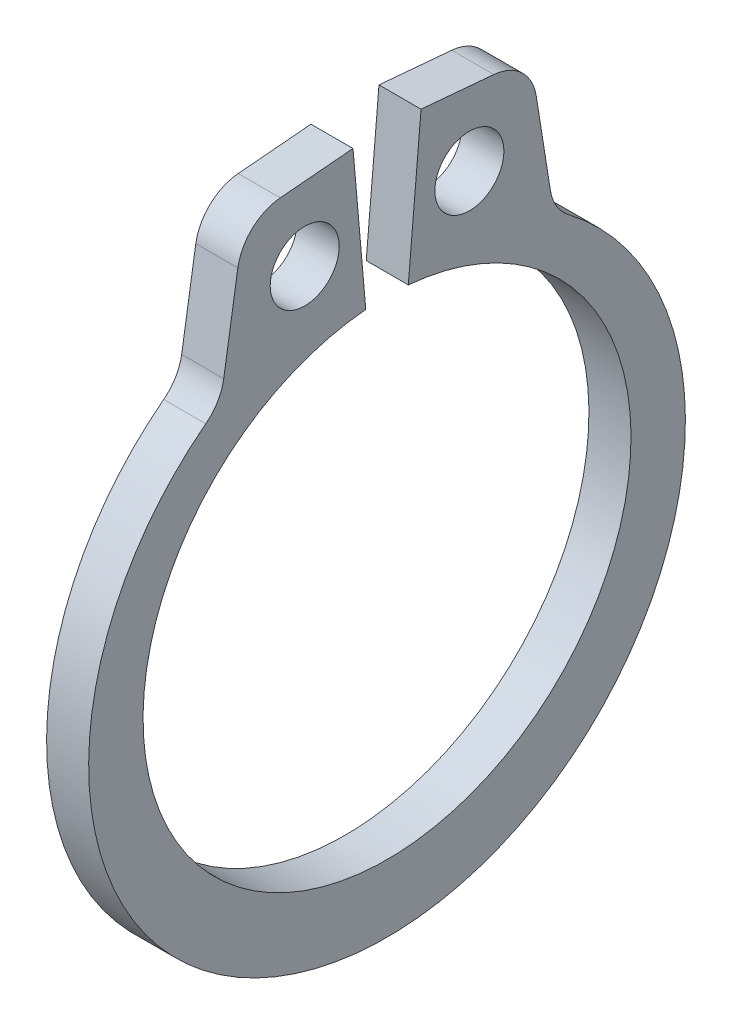
ISO-10303-21;
HEADER;
FILE_DESCRIPTION(('STEP AP214'),'2;1');
FILE_NAME('part.step','',(''),(''),'','','');
FILE_SCHEMA(('AUTOMOTIVE_DESIGN { 1 0 10303 214 1 1 1 1 }'));
ENDSEC;
DATA;
#1=APPLICATION_CONTEXT('core data for automotive mechanical design processes');
#2=APPLICATION_PROTOCOL_DEFINITION('international standard','automotive_design',2000,#1);
#3=PRODUCT_CONTEXT('',#1,'mechanical');
#4=PRODUCT('Part','Part','',(#3));
#5=PRODUCT_RELATED_PRODUCT_CATEGORY('part','',(#4));
#6=PRODUCT_DEFINITION_FORMATION('','',#4);
#7=PRODUCT_DEFINITION_CONTEXT('part definition',#1,'design');
#8=PRODUCT_DEFINITION('design','',#6,#7);
#9=PRODUCT_DEFINITION_SHAPE('','',#8);
#10=(LENGTH_UNIT() NAMED_UNIT(*) SI_UNIT(.MILLI.,.METRE.));
#11=(NAMED_UNIT(*) PLANE_ANGLE_UNIT() SI_UNIT($,.RADIAN.));
#12=(NAMED_UNIT(*) SI_UNIT($,.STERADIAN.) SOLID_ANGLE_UNIT());
#13=UNCERTAINTY_MEASURE_WITH_UNIT(LENGTH_MEASURE(1.E-05),#10,'distance_accuracy_value','');
#14=(GEOMETRIC_REPRESENTATION_CONTEXT(3) GLOBAL_UNCERTAINTY_ASSIGNED_CONTEXT((#13)) GLOBAL_UNIT_ASSIGNED_CONTEXT((#10,
#11,#12)) REPRESENTATION_CONTEXT('',''));
#15=CARTESIAN_POINT('',(0.,0.,0.));
#16=DIRECTION('',(0.,0.,1.));
#17=DIRECTION('',(1.,0.,0.));
#18=AXIS2_PLACEMENT_3D('',#15,#16,#17);
#19=CARTESIAN_POINT('',(0.3175,0.,0.));
#20=DIRECTION('',(1.,0.,0.));
#21=DIRECTION('',(0.,0.,-1.));
#22=AXIS2_PLACEMENT_3D('',#19,#20,#21);
#23=PLANE('',#22);
#24=CARTESIAN_POINT('',(0.3175,4.69745680987205,-1.24281462214269));
#25=DIRECTION('',(-1.,0.,0.));
#26=DIRECTION('',(0.,0.,1.));
#27=AXIS2_PLACEMENT_3D('',#24,#25,#26);
#28=CIRCLE('',#27,0.5207);
#29=CARTESIAN_POINT('',(0.3175,4.69745680987205,-0.722114622142691));
#30=VERTEX_POINT('',#29);
#31=EDGE_CURVE('E170',#30,#30,#28,.T.);
#32=ORIENTED_EDGE('',*,*,#31,.T.);
#33=EDGE_LOOP('',(#32));
#34=FACE_BOUND('',#33,.T.);
#35=CARTESIAN_POINT('',(0.3175,0.,0.));
#36=DIRECTION('',(-1.,0.,0.));
#37=DIRECTION('',(0.,0.,1.));
#38=AXIS2_PLACEMENT_3D('',#35,#36,#37);
#39=CIRCLE('',#38,3.683);
#40=CARTESIAN_POINT('',(0.3175,3.6689850730719,-0.320994600539626));
#41=VERTEX_POINT('',#40);
#42=CARTESIAN_POINT('',(0.3175,3.6689850730719,0.320994600539626));
#43=VERTEX_POINT('',#42);
#44=EDGE_CURVE('E176',#41,#43,#39,.T.);
#45=ORIENTED_EDGE('',*,*,#44,.T.);
#46=DIRECTION('',(0.,-0.996194698091746,-0.0871557427476585));
#47=VECTOR('',#46,1.);
#48=CARTESIAN_POINT('',(0.3175,3.6689850730719,0.320994600539626));
#49=LINE('',#48,#47);
#50=CARTESIAN_POINT('',(0.3175,5.87037611691504,0.513591360863402));
#51=VERTEX_POINT('',#50);
#52=EDGE_CURVE('E124',#43,#51,#49,.F.);
#53=ORIENTED_EDGE('',*,*,#52,.T.);
#54=DIRECTION('',(0.,0.0871557427476586,-0.996194698091746));
#55=VECTOR('',#54,1.);
#56=CARTESIAN_POINT('',(0.3175,5.87037611691504,0.513591360863401));
#57=LINE('',#56,#55);
#58=CARTESIAN_POINT('',(0.3175,5.77432624728069,1.61144639445742));
#59=VERTEX_POINT('',#58);
#60=EDGE_CURVE('E119',#51,#59,#57,.F.);
#61=ORIENTED_EDGE('',*,*,#60,.T.);
#62=CARTESIAN_POINT('',(0.3175,5.06583257799784,1.54946123021528));
#63=DIRECTION('',(-1.,0.,0.));
#64=DIRECTION('',(0.,0.,1.));
#65=AXIS2_PLACEMENT_3D('',#62,#63,#64);
#66=CIRCLE('',#65,0.7112);
#67=CARTESIAN_POINT('',(0.3175,5.17751694407732,2.25183722807784));
#68=VERTEX_POINT('',#67);
#69=EDGE_CURVE('E112',#68,#59,#66,.T.);
#70=ORIENTED_EDGE('',*,*,#69,.F.);
#71=DIRECTION('',(0.,0.987592797894485,-0.157036510235495));
#72=VECTOR('',#71,1.);
#73=CARTESIAN_POINT('',(0.3175,5.7259285466722,2.16463464374576));
#74=LINE('',#73,#72);
#75=CARTESIAN_POINT('',(0.3175,3.83630856012022,2.46510193045745));
#76=VERTEX_POINT('',#75);
#77=EDGE_CURVE('E106',#68,#76,#74,.F.);
#78=ORIENTED_EDGE('',*,*,#77,.T.);
#79=CARTESIAN_POINT('',(0.3175,3.94799292619971,3.16747792832001));
#80=DIRECTION('',(-1.,0.,0.));
#81=DIRECTION('',(0.,0.,1.));
#82=AXIS2_PLACEMENT_3D('',#79,#80,#81);
#83=CIRCLE('',#82,0.7112);
#84=CARTESIAN_POINT('',(0.3175,3.38299732807386,2.73552259023698));
#85=VERTEX_POINT('',#84);
#86=EDGE_CURVE('E20',#76,#85,#83,.T.);
#87=ORIENTED_EDGE('',*,*,#86,.T.);
#88=CARTESIAN_POINT('',(0.3175,-0.195053654966973,0.));
#89=DIRECTION('',(-1.,0.,0.));
#90=DIRECTION('',(0.,0.,1.));
#91=AXIS2_PLACEMENT_3D('',#88,#89,#90);
#92=CIRCLE('',#91,4.50394634503303);
#93=CARTESIAN_POINT('',(0.3175,3.38299732807386,-2.73552259023698));
#94=VERTEX_POINT('',#93);
#95=EDGE_CURVE('E182',#94,#85,#92,.T.);
#96=ORIENTED_EDGE('',*,*,#95,.F.);
#97=CARTESIAN_POINT('',(0.3175,3.94799292619971,-3.16747792832001));
#98=DIRECTION('',(-1.,0.,0.));
#99=DIRECTION('',(0.,0.,1.));
#100=AXIS2_PLACEMENT_3D('',#97,#98,#99);
#101=CIRCLE('',#100,0.7112);
#102=CARTESIAN_POINT('',(0.3175,3.83630856012022,-2.46510193045745));
#103=VERTEX_POINT('',#102);
#104=EDGE_CURVE('E180',#94,#103,#101,.T.);
#105=ORIENTED_EDGE('',*,*,#104,.T.);
#106=DIRECTION('',(0.,-0.987592797894485,-0.157036510235495));
#107=VECTOR('',#106,1.);
#108=CARTESIAN_POINT('',(0.3175,5.7259285466722,-2.16463464374576));
#109=LINE('',#108,#107);
#110=CARTESIAN_POINT('',(0.3175,5.17751694407732,-2.25183722807784));
#111=VERTEX_POINT('',#110);
#112=EDGE_CURVE('E143',#103,#111,#109,.F.);
#113=ORIENTED_EDGE('',*,*,#112,.T.);
#114=CARTESIAN_POINT('',(0.3175,5.06583257799784,-1.54946123021528));
#115=DIRECTION('',(-1.,0.,0.));
#116=DIRECTION('',(0.,0.,1.));
#117=AXIS2_PLACEMENT_3D('',#114,#115,#116);
#118=CIRCLE('',#117,0.7112);
#119=CARTESIAN_POINT('',(0.3175,5.77432624728069,-1.61144639445742));
#120=VERTEX_POINT('',#119);
#121=EDGE_CURVE('E145',#120,#111,#118,.T.);
#122=ORIENTED_EDGE('',*,*,#121,.F.);
#123=DIRECTION('',(0.,-0.0871557427476586,-0.996194698091746));
#124=VECTOR('',#123,1.);
#125=CARTESIAN_POINT('',(0.3175,5.87037611691504,-0.513591360863401));
#126=LINE('',#125,#124);
#127=CARTESIAN_POINT('',(0.3175,5.87037611691504,-0.513591360863402));
#128=VERTEX_POINT('',#127);
#129=EDGE_CURVE('E137',#120,#128,#126,.F.);
#130=ORIENTED_EDGE('',*,*,#129,.T.);
#131=DIRECTION('',(0.,0.996194698091746,-0.0871557427476585));
#132=VECTOR('',#131,1.);
#133=CARTESIAN_POINT('',(0.3175,3.6689850730719,-0.320994600539626));
#134=LINE('',#133,#132);
#135=EDGE_CURVE('E130',#128,#41,#134,.F.);
#136=ORIENTED_EDGE('',*,*,#135,.T.);
#137=EDGE_LOOP('',(#45,#53,#61,#70,#78,#87,#96,#105,#113,#122,#130,#136));
#138=FACE_BOUND('',#137,.T.);
#139=CARTESIAN_POINT('',(0.3175,4.69745680987205,1.24281462214269));
#140=DIRECTION('',(-1.,0.,0.));
#141=DIRECTION('',(0.,0.,1.));
#142=AXIS2_PLACEMENT_3D('',#139,#140,#141);
#143=CIRCLE('',#142,0.5207);
#144=CARTESIAN_POINT('',(0.3175,4.69745680987205,1.76351462214269));
#145=VERTEX_POINT('',#144);
#146=EDGE_CURVE('E108',#145,#145,#143,.T.);
#147=ORIENTED_EDGE('',*,*,#146,.T.);
#148=EDGE_LOOP('',(#147));
#149=FACE_BOUND('',#148,.T.);
#150=ADVANCED_FACE('F17',(#34,#138,#149),#23,.T.);
#151=CARTESIAN_POINT('',(0.3175,3.94799292619971,3.16747792832001));
#152=DIRECTION('',(-1.,0.,0.));
#153=DIRECTION('',(0.,0.,1.));
#154=AXIS2_PLACEMENT_3D('',#151,#152,#153);
#155=CYLINDRICAL_SURFACE('',#154,0.7112);
#156=DIRECTION('',(1.,0.,0.));
#157=VECTOR('',#156,1.);
#158=CARTESIAN_POINT('',(0.3175,3.83630856012022,2.46510193045745));
#159=LINE('',#158,#157);
#160=CARTESIAN_POINT('',(-0.3175,3.83630856012022,2.46510193045745));
#161=VERTEX_POINT('',#160);
#162=EDGE_CURVE('E101',#76,#161,#159,.F.);
#163=ORIENTED_EDGE('',*,*,#162,.T.);
#164=CARTESIAN_POINT('',(-0.3175,3.94799292619971,3.16747792832001));
#165=DIRECTION('',(-1.,0.,0.));
#166=DIRECTION('',(0.,0.,1.));
#167=AXIS2_PLACEMENT_3D('',#164,#165,#166);
#168=CIRCLE('',#167,0.7112);
#169=CARTESIAN_POINT('',(-0.3175,3.38299732807386,2.73552259023698));
#170=VERTEX_POINT('',#169);
#171=EDGE_CURVE('E168',#161,#170,#168,.T.);
#172=ORIENTED_EDGE('',*,*,#171,.T.);
#173=DIRECTION('',(-1.,0.,0.));
#174=VECTOR('',#173,1.);
#175=CARTESIAN_POINT('',(0.3175,3.38299732807386,2.73552259023698));
#176=LINE('',#175,#174);
#177=EDGE_CURVE('E102',#85,#170,#176,.T.);
#178=ORIENTED_EDGE('',*,*,#177,.F.);
#179=ORIENTED_EDGE('',*,*,#86,.F.);
#180=EDGE_LOOP('',(#163,#172,#178,#179));
#181=FACE_BOUND('',#180,.T.);
#182=ADVANCED_FACE('F99',(#181),#155,.F.);
#183=CARTESIAN_POINT('',(0.3175,-0.195053654966973,0.));
#184=DIRECTION('',(-1.,0.,0.));
#185=DIRECTION('',(0.,0.,1.));
#186=AXIS2_PLACEMENT_3D('',#183,#184,#185);
#187=CYLINDRICAL_SURFACE('',#186,4.50394634503303);
#188=CARTESIAN_POINT('',(-0.3175,-0.195053654966973,0.));
#189=DIRECTION('',(-1.,0.,0.));
#190=DIRECTION('',(0.,0.,1.));
#191=AXIS2_PLACEMENT_3D('',#188,#189,#190);
#192=CIRCLE('',#191,4.50394634503303);
#193=CARTESIAN_POINT('',(-0.3175,3.38299732807386,-2.73552259023699));
#194=VERTEX_POINT('',#193);
#195=EDGE_CURVE('E166',#170,#194,#192,.F.);
#196=ORIENTED_EDGE('',*,*,#195,.T.);
#197=DIRECTION('',(-1.,0.,0.));
#198=VECTOR('',#197,1.);
#199=CARTESIAN_POINT('',(0.3175,3.38299732807386,-2.73552259023699));
#200=LINE('',#199,#198);
#201=EDGE_CURVE('E181',#194,#94,#200,.F.);
#202=ORIENTED_EDGE('',*,*,#201,.T.);
#203=ORIENTED_EDGE('',*,*,#95,.T.);
#204=ORIENTED_EDGE('',*,*,#177,.T.);
#205=EDGE_LOOP('',(#196,#202,#203,#204));
#206=FACE_BOUND('',#205,.T.);
#207=ADVANCED_FACE('F187',(#206),#187,.T.);
#208=CARTESIAN_POINT('',(0.3175,3.94799292619971,-3.16747792832001));
#209=DIRECTION('',(-1.,0.,0.));
#210=DIRECTION('',(0.,0.,1.));
#211=AXIS2_PLACEMENT_3D('',#208,#209,#210);
#212=CYLINDRICAL_SURFACE('',#211,0.7112);
#213=ORIENTED_EDGE('',*,*,#201,.F.);
#214=CARTESIAN_POINT('',(-0.3175,3.94799292619971,-3.16747792832001));
#215=DIRECTION('',(-1.,0.,0.));
#216=DIRECTION('',(0.,0.,1.));
#217=AXIS2_PLACEMENT_3D('',#214,#215,#216);
#218=CIRCLE('',#217,0.7112);
#219=CARTESIAN_POINT('',(-0.3175,3.83630856012022,-2.46510193045745));
#220=VERTEX_POINT('',#219);
#221=EDGE_CURVE('E163',#194,#220,#218,.T.);
#222=ORIENTED_EDGE('',*,*,#221,.T.);
#223=DIRECTION('',(1.,0.,0.));
#224=VECTOR('',#223,1.);
#225=CARTESIAN_POINT('',(0.3175,3.83630856012022,-2.46510193045745));
#226=LINE('',#225,#224);
#227=EDGE_CURVE('E146',#220,#103,#226,.T.);
#228=ORIENTED_EDGE('',*,*,#227,.T.);
#229=ORIENTED_EDGE('',*,*,#104,.F.);
#230=EDGE_LOOP('',(#213,#222,#228,#229));
#231=FACE_BOUND('',#230,.T.);
#232=ADVANCED_FACE('F198',(#231),#212,.F.);
#233=CARTESIAN_POINT('',(0.3175,5.7259285466722,-2.16463464374576));
#234=DIRECTION('',(0.,-0.157036510235495,0.987592797894485));
#235=DIRECTION('',(0.,-0.987592797894485,-0.157036510235495));
#236=AXIS2_PLACEMENT_3D('',#233,#234,#235);
#237=PLANE('',#236);
#238=ORIENTED_EDGE('',*,*,#227,.F.);
#239=DIRECTION('',(0.,0.987592797894485,0.157036510235495));
#240=VECTOR('',#239,1.);
#241=CARTESIAN_POINT('',(-0.3175,3.83630856012022,-2.46510193045745));
#242=LINE('',#241,#240);
#243=CARTESIAN_POINT('',(-0.3175,5.17751694407732,-2.25183722807784));
#244=VERTEX_POINT('',#243);
#245=EDGE_CURVE('E162',#220,#244,#242,.T.);
#246=ORIENTED_EDGE('',*,*,#245,.T.);
#247=DIRECTION('',(-1.,0.,0.));
#248=VECTOR('',#247,1.);
#249=CARTESIAN_POINT('',(0.3175,5.17751694407732,-2.25183722807784));
#250=LINE('',#249,#248);
#251=EDGE_CURVE('E179',#111,#244,#250,.T.);
#252=ORIENTED_EDGE('',*,*,#251,.F.);
#253=ORIENTED_EDGE('',*,*,#112,.F.);
#254=EDGE_LOOP('',(#238,#246,#252,#253));
#255=FACE_BOUND('',#254,.T.);
#256=ADVANCED_FACE('F203',(#255),#237,.F.);
#257=CARTESIAN_POINT('',(0.3175,5.06583257799784,-1.54946123021528));
#258=DIRECTION('',(-1.,0.,0.));
#259=DIRECTION('',(0.,0.,1.));
#260=AXIS2_PLACEMENT_3D('',#257,#258,#259);
#261=CYLINDRICAL_SURFACE('',#260,0.7112);
#262=CARTESIAN_POINT('',(-0.3175,5.06583257799784,-1.54946123021528));
#263=DIRECTION('',(-1.,0.,0.));
#264=DIRECTION('',(0.,0.,1.));
#265=AXIS2_PLACEMENT_3D('',#262,#263,#264);
#266=CIRCLE('',#265,0.7112);
#267=CARTESIAN_POINT('',(-0.3175,5.77432624728069,-1.61144639445742));
#268=VERTEX_POINT('',#267);
#269=EDGE_CURVE('E158',#244,#268,#266,.F.);
#270=ORIENTED_EDGE('',*,*,#269,.T.);
#271=DIRECTION('',(1.,0.,0.));
#272=VECTOR('',#271,1.);
#273=CARTESIAN_POINT('',(0.3175,5.77432624728069,-1.61144639445742));
#274=LINE('',#273,#272);
#275=EDGE_CURVE('E140',#268,#120,#274,.T.);
#276=ORIENTED_EDGE('',*,*,#275,.T.);
#277=ORIENTED_EDGE('',*,*,#121,.T.);
#278=ORIENTED_EDGE('',*,*,#251,.T.);
#279=EDGE_LOOP('',(#270,#276,#277,#278));
#280=FACE_BOUND('',#279,.T.);
#281=ADVANCED_FACE('F266',(#280),#261,.T.);
#282=CARTESIAN_POINT('',(0.3175,5.87037611691504,-0.513591360863401));
#283=DIRECTION('',(0.,-0.996194698091746,0.0871557427476586));
#284=DIRECTION('',(0.,-0.0871557427476586,-0.996194698091746));
#285=AXIS2_PLACEMENT_3D('',#282,#283,#284);
#286=PLANE('',#285);
#287=ORIENTED_EDGE('',*,*,#275,.F.);
#288=DIRECTION('',(0.,0.0871557427476588,0.996194698091745));
#289=VECTOR('',#288,1.);
#290=CARTESIAN_POINT('',(-0.3175,5.77432624728069,-1.61144639445742));
#291=LINE('',#290,#289);
#292=CARTESIAN_POINT('',(-0.3175,5.87037611691504,-0.513591360863402));
#293=VERTEX_POINT('',#292);
#294=EDGE_CURVE('E161',#268,#293,#291,.T.);
#295=ORIENTED_EDGE('',*,*,#294,.T.);
#296=DIRECTION('',(1.,0.,0.));
#297=VECTOR('',#296,1.);
#298=CARTESIAN_POINT('',(0.3175,5.87037611691504,-0.513591360863402));
#299=LINE('',#298,#297);
#300=EDGE_CURVE('E134',#293,#128,#299,.T.);
#301=ORIENTED_EDGE('',*,*,#300,.T.);
#302=ORIENTED_EDGE('',*,*,#129,.F.);
#303=EDGE_LOOP('',(#287,#295,#301,#302));
#304=FACE_BOUND('',#303,.T.);
#305=ADVANCED_FACE('F264',(#304),#286,.F.);
#306=CARTESIAN_POINT('',(0.3175,3.6689850730719,-0.320994600539626));
#307=DIRECTION('',(0.,-0.0871557427476585,-0.996194698091746));
#308=DIRECTION('',(0.,0.996194698091746,-0.0871557427476585));
#309=AXIS2_PLACEMENT_3D('',#306,#307,#308);
#310=PLANE('',#309);
#311=DIRECTION('',(-1.,0.,0.));
#312=VECTOR('',#311,1.);
#313=CARTESIAN_POINT('',(0.3175,3.6689850730719,-0.320994600539626));
#314=LINE('',#313,#312);
#315=CARTESIAN_POINT('',(-0.3175,3.6689850730719,-0.320994600539626));
#316=VERTEX_POINT('',#315);
#317=EDGE_CURVE('E133',#316,#41,#314,.F.);
#318=ORIENTED_EDGE('',*,*,#317,.T.);
#319=ORIENTED_EDGE('',*,*,#135,.F.);
#320=ORIENTED_EDGE('',*,*,#300,.F.);
#321=DIRECTION('',(0.,-0.996194698091746,0.0871557427476584));
#322=VECTOR('',#321,1.);
#323=CARTESIAN_POINT('',(-0.3175,5.87037611691504,-0.513591360863401));
#324=LINE('',#323,#322);
#325=EDGE_CURVE('E157',#293,#316,#324,.T.);
#326=ORIENTED_EDGE('',*,*,#325,.T.);
#327=EDGE_LOOP('',(#318,#319,#320,#326));
#328=FACE_BOUND('',#327,.T.);
#329=ADVANCED_FACE('F259',(#328),#310,.F.);
#330=CARTESIAN_POINT('',(0.3175,0.,0.));
#331=DIRECTION('',(-1.,0.,0.));
#332=DIRECTION('',(0.,0.,1.));
#333=AXIS2_PLACEMENT_3D('',#330,#331,#332);
#334=CYLINDRICAL_SURFACE('',#333,3.683);
#335=ORIENTED_EDGE('',*,*,#44,.F.);
#336=ORIENTED_EDGE('',*,*,#317,.F.);
#337=CARTESIAN_POINT('',(-0.3175,0.,0.));
#338=DIRECTION('',(-1.,0.,0.));
#339=DIRECTION('',(0.,0.,1.));
#340=AXIS2_PLACEMENT_3D('',#337,#338,#339);
#341=CIRCLE('',#340,3.683);
#342=CARTESIAN_POINT('',(-0.3175,3.6689850730719,0.320994600539626));
#343=VERTEX_POINT('',#342);
#344=EDGE_CURVE('E154',#316,#343,#341,.T.);
#345=ORIENTED_EDGE('',*,*,#344,.T.);
#346=DIRECTION('',(1.,0.,0.));
#347=VECTOR('',#346,1.);
#348=CARTESIAN_POINT('',(0.3175,3.6689850730719,0.320994600539626));
#349=LINE('',#348,#347);
#350=EDGE_CURVE('E127',#343,#43,#349,.T.);
#351=ORIENTED_EDGE('',*,*,#350,.T.);
#352=EDGE_LOOP('',(#335,#336,#345,#351));
#353=FACE_BOUND('',#352,.T.);
#354=ADVANCED_FACE('F254',(#353),#334,.F.);
#355=CARTESIAN_POINT('',(0.3175,3.6689850730719,0.320994600539626));
#356=DIRECTION('',(0.,-0.0871557427476585,0.996194698091746));
#357=DIRECTION('',(0.,-0.996194698091746,-0.0871557427476585));
#358=AXIS2_PLACEMENT_3D('',#355,#356,#357);
#359=PLANE('',#358);
#360=DIRECTION('',(1.,0.,0.));
#361=VECTOR('',#360,1.);
#362=CARTESIAN_POINT('',(0.3175,5.87037611691504,0.513591360863401));
#363=LINE('',#362,#361);
#364=CARTESIAN_POINT('',(-0.3175,5.87037611691504,0.513591360863401));
#365=VERTEX_POINT('',#364);
#366=EDGE_CURVE('E121',#365,#51,#363,.T.);
#367=ORIENTED_EDGE('',*,*,#366,.T.);
#368=ORIENTED_EDGE('',*,*,#52,.F.);
#369=ORIENTED_EDGE('',*,*,#350,.F.);
#370=DIRECTION('',(0.,0.996194698091746,0.0871557427476584));
#371=VECTOR('',#370,1.);
#372=CARTESIAN_POINT('',(-0.3175,3.6689850730719,0.320994600539626));
#373=LINE('',#372,#371);
#374=EDGE_CURVE('E156',#343,#365,#373,.T.);
#375=ORIENTED_EDGE('',*,*,#374,.T.);
#376=EDGE_LOOP('',(#367,#368,#369,#375));
#377=FACE_BOUND('',#376,.T.);
#378=ADVANCED_FACE('F251',(#377),#359,.F.);
#379=CARTESIAN_POINT('',(0.3175,5.87037611691504,0.513591360863401));
#380=DIRECTION('',(0.,-0.996194698091746,-0.0871557427476586));
#381=DIRECTION('',(0.,0.0871557427476586,-0.996194698091746));
#382=AXIS2_PLACEMENT_3D('',#379,#380,#381);
#383=PLANE('',#382);
#384=DIRECTION('',(-1.,0.,0.));
#385=VECTOR('',#384,1.);
#386=CARTESIAN_POINT('',(0.3175,5.77432624728069,1.61144639445742));
#387=LINE('',#386,#385);
#388=CARTESIAN_POINT('',(-0.3175,5.77432624728069,1.61144639445742));
#389=VERTEX_POINT('',#388);
#390=EDGE_CURVE('E114',#59,#389,#387,.T.);
#391=ORIENTED_EDGE('',*,*,#390,.F.);
#392=ORIENTED_EDGE('',*,*,#60,.F.);
#393=ORIENTED_EDGE('',*,*,#366,.F.);
#394=DIRECTION('',(0.,-0.0871557427476588,0.996194698091745));
#395=VECTOR('',#394,1.);
#396=CARTESIAN_POINT('',(-0.3175,5.87037611691504,0.513591360863401));
#397=LINE('',#396,#395);
#398=EDGE_CURVE('E153',#365,#389,#397,.T.);
#399=ORIENTED_EDGE('',*,*,#398,.T.);
#400=EDGE_LOOP('',(#391,#392,#393,#399));
#401=FACE_BOUND('',#400,.T.);
#402=ADVANCED_FACE('F244',(#401),#383,.F.);
#403=CARTESIAN_POINT('',(0.3175,5.06583257799784,1.54946123021528));
#404=DIRECTION('',(-1.,0.,0.));
#405=DIRECTION('',(0.,0.,1.));
#406=AXIS2_PLACEMENT_3D('',#403,#404,#405);
#407=CYLINDRICAL_SURFACE('',#406,0.7112);
#408=CARTESIAN_POINT('',(-0.3175,5.06583257799784,1.54946123021528));
#409=DIRECTION('',(-1.,0.,0.));
#410=DIRECTION('',(0.,0.,1.));
#411=AXIS2_PLACEMENT_3D('',#408,#409,#410);
#412=CIRCLE('',#411,0.7112);
#413=CARTESIAN_POINT('',(-0.3175,5.17751694407732,2.25183722807784));
#414=VERTEX_POINT('',#413);
#415=EDGE_CURVE('E150',#389,#414,#412,.F.);
#416=ORIENTED_EDGE('',*,*,#415,.T.);
#417=DIRECTION('',(1.,0.,0.));
#418=VECTOR('',#417,1.);
#419=CARTESIAN_POINT('',(0.3175,5.17751694407732,2.25183722807784));
#420=LINE('',#419,#418);
#421=EDGE_CURVE('E35',#414,#68,#420,.T.);
#422=ORIENTED_EDGE('',*,*,#421,.T.);
#423=ORIENTED_EDGE('',*,*,#69,.T.);
#424=ORIENTED_EDGE('',*,*,#390,.T.);
#425=EDGE_LOOP('',(#416,#422,#423,#424));
#426=FACE_BOUND('',#425,.T.);
#427=ADVANCED_FACE('F294',(#426),#407,.T.);
#428=CARTESIAN_POINT('',(0.3175,5.7259285466722,2.16463464374576));
#429=DIRECTION('',(0.,-0.157036510235495,-0.987592797894485));
#430=DIRECTION('',(0.,0.987592797894485,-0.157036510235495));
#431=AXIS2_PLACEMENT_3D('',#428,#429,#430);
#432=PLANE('',#431);
#433=ORIENTED_EDGE('',*,*,#162,.F.);
#434=ORIENTED_EDGE('',*,*,#77,.F.);
#435=ORIENTED_EDGE('',*,*,#421,.F.);
#436=DIRECTION('',(0.,-0.987592797894485,0.157036510235495));
#437=VECTOR('',#436,1.);
#438=CARTESIAN_POINT('',(-0.3175,5.17751694407732,2.25183722807784));
#439=LINE('',#438,#437);
#440=EDGE_CURVE('E107',#414,#161,#439,.T.);
#441=ORIENTED_EDGE('',*,*,#440,.T.);
#442=EDGE_LOOP('',(#433,#434,#435,#441));
#443=FACE_BOUND('',#442,.T.);
#444=ADVANCED_FACE('F105',(#443),#432,.F.);
#445=CARTESIAN_POINT('',(0.3175,4.69745680987205,1.24281462214269));
#446=DIRECTION('',(-1.,0.,0.));
#447=DIRECTION('',(0.,0.,1.));
#448=AXIS2_PLACEMENT_3D('',#445,#446,#447);
#449=CYLINDRICAL_SURFACE('',#448,0.5207);
#450=CARTESIAN_POINT('',(-0.3175,4.69745680987205,1.24281462214269));
#451=DIRECTION('',(-1.,0.,0.));
#452=DIRECTION('',(0.,0.,1.));
#453=AXIS2_PLACEMENT_3D('',#450,#451,#452);
#454=CIRCLE('',#453,0.5207);
#455=CARTESIAN_POINT('',(-0.3175,4.69745680987205,1.76351462214269));
#456=VERTEX_POINT('',#455);
#457=EDGE_CURVE('E26',#456,#456,#454,.T.);
#458=ORIENTED_EDGE('',*,*,#457,.T.);
#459=EDGE_LOOP('',(#458));
#460=FACE_BOUND('',#459,.T.);
#461=ORIENTED_EDGE('',*,*,#146,.F.);
#462=EDGE_LOOP('',(#461));
#463=FACE_BOUND('',#462,.T.);
#464=ADVANCED_FACE('F283',(#460,#463),#449,.F.);
#465=CARTESIAN_POINT('',(0.3175,4.69745680987205,-1.24281462214269));
#466=DIRECTION('',(-1.,0.,0.));
#467=DIRECTION('',(0.,0.,1.));
#468=AXIS2_PLACEMENT_3D('',#465,#466,#467);
#469=CYLINDRICAL_SURFACE('',#468,0.5207);
#470=CARTESIAN_POINT('',(-0.3175,4.69745680987205,-1.24281462214269));
#471=DIRECTION('',(-1.,0.,0.));
#472=DIRECTION('',(0.,0.,1.));
#473=AXIS2_PLACEMENT_3D('',#470,#471,#472);
#474=CIRCLE('',#473,0.5207);
#475=CARTESIAN_POINT('',(-0.3175,4.69745680987205,-0.722114622142691));
#476=VERTEX_POINT('',#475);
#477=EDGE_CURVE('E11',#476,#476,#474,.T.);
#478=ORIENTED_EDGE('',*,*,#477,.T.);
#479=EDGE_LOOP('',(#478));
#480=FACE_BOUND('',#479,.T.);
#481=ORIENTED_EDGE('',*,*,#31,.F.);
#482=EDGE_LOOP('',(#481));
#483=FACE_BOUND('',#482,.T.);
#484=ADVANCED_FACE('F277',(#480,#483),#469,.F.);
#485=CARTESIAN_POINT('',(-0.3175,0.,0.));
#486=DIRECTION('',(1.,0.,0.));
#487=DIRECTION('',(0.,0.,-1.));
#488=AXIS2_PLACEMENT_3D('',#485,#486,#487);
#489=PLANE('',#488);
#490=ORIENTED_EDGE('',*,*,#477,.F.);
#491=EDGE_LOOP('',(#490));
#492=FACE_BOUND('',#491,.T.);
#493=ORIENTED_EDGE('',*,*,#457,.F.);
#494=EDGE_LOOP('',(#493));
#495=FACE_BOUND('',#494,.T.);
#496=ORIENTED_EDGE('',*,*,#415,.F.);
#497=ORIENTED_EDGE('',*,*,#398,.F.);
#498=ORIENTED_EDGE('',*,*,#374,.F.);
#499=ORIENTED_EDGE('',*,*,#344,.F.);
#500=ORIENTED_EDGE('',*,*,#325,.F.);
#501=ORIENTED_EDGE('',*,*,#294,.F.);
#502=ORIENTED_EDGE('',*,*,#269,.F.);
#503=ORIENTED_EDGE('',*,*,#245,.F.);
#504=ORIENTED_EDGE('',*,*,#221,.F.);
#505=ORIENTED_EDGE('',*,*,#195,.F.);
#506=ORIENTED_EDGE('',*,*,#171,.F.);
#507=ORIENTED_EDGE('',*,*,#440,.F.);
#508=EDGE_LOOP('',(#496,#497,#498,#499,#500,#501,#502,#503,#504,#505,#506,#507));
#509=FACE_BOUND('',#508,.T.);
#510=ADVANCED_FACE('F192',(#492,#495,#509),#489,.F.);
#511=CLOSED_SHELL('',(#150,#182,#207,#232,#256,#281,#305,#329,#354,#378,#402,#427,#444,#464,
#484,#510));
#512=MANIFOLD_SOLID_BREP('B1',#511);
#513=ADVANCED_BREP_SHAPE_REPRESENTATION('',(#18,#512),#14);
#514=SHAPE_DEFINITION_REPRESENTATION(#9,#513);
ENDSEC;
END-ISO-10303-21;
